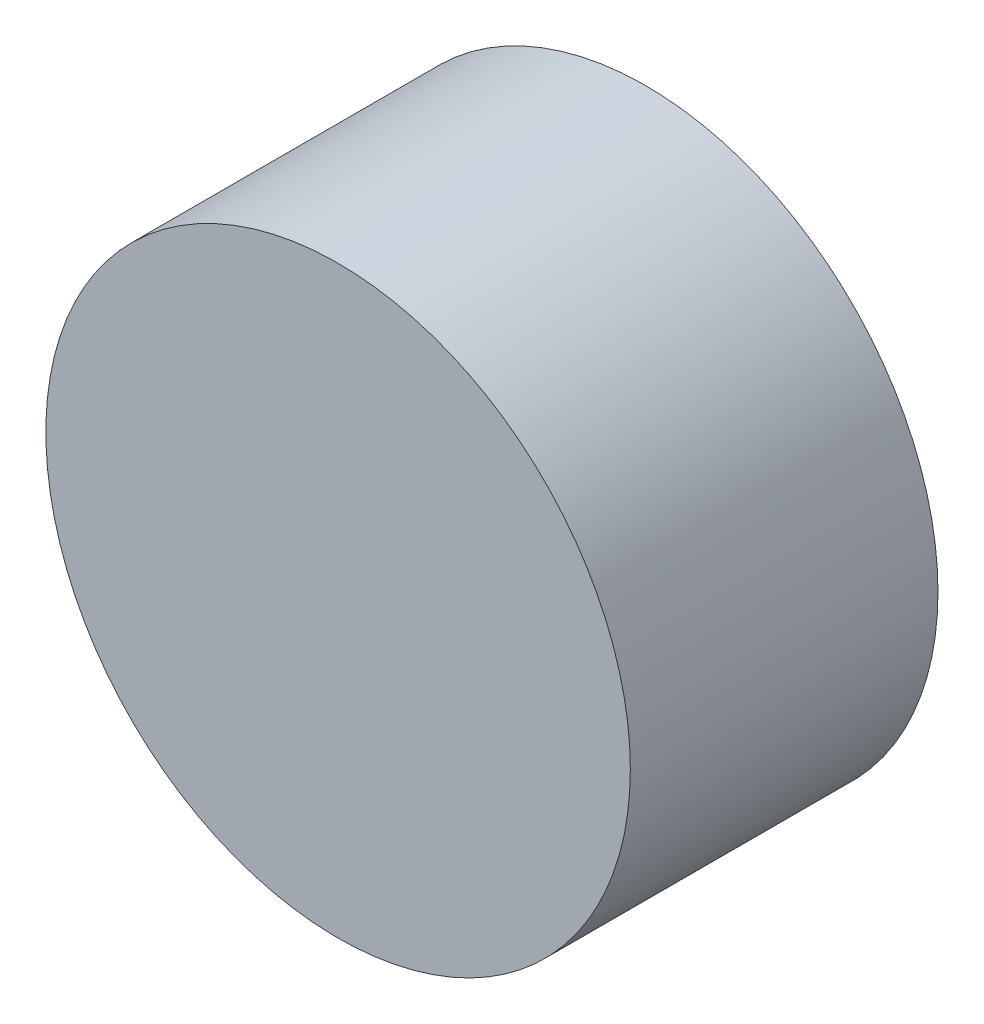
ISO-10303-21;
HEADER;
FILE_DESCRIPTION(('STEP AP214'),'2;1');
FILE_NAME('part.step','',(''),(''),'','','');
FILE_SCHEMA(('AUTOMOTIVE_DESIGN { 1 0 10303 214 1 1 1 1 }'));
ENDSEC;
DATA;
#1=APPLICATION_CONTEXT('core data for automotive mechanical design processes');
#2=APPLICATION_PROTOCOL_DEFINITION('international standard','automotive_design',2000,#1);
#3=PRODUCT_CONTEXT('',#1,'mechanical');
#4=PRODUCT('Part','Part','',(#3));
#5=PRODUCT_RELATED_PRODUCT_CATEGORY('part','',(#4));
#6=PRODUCT_DEFINITION_FORMATION('','',#4);
#7=PRODUCT_DEFINITION_CONTEXT('part definition',#1,'design');
#8=PRODUCT_DEFINITION('design','',#6,#7);
#9=PRODUCT_DEFINITION_SHAPE('','',#8);
#10=(LENGTH_UNIT() NAMED_UNIT(*) SI_UNIT(.MILLI.,.METRE.));
#11=(NAMED_UNIT(*) PLANE_ANGLE_UNIT() SI_UNIT($,.RADIAN.));
#12=(NAMED_UNIT(*) SI_UNIT($,.STERADIAN.) SOLID_ANGLE_UNIT());
#13=UNCERTAINTY_MEASURE_WITH_UNIT(LENGTH_MEASURE(1.E-05),#10,'distance_accuracy_value','');
#14=(GEOMETRIC_REPRESENTATION_CONTEXT(3) GLOBAL_UNCERTAINTY_ASSIGNED_CONTEXT((#13)) GLOBAL_UNIT_ASSIGNED_CONTEXT((#10,
#11,#12)) REPRESENTATION_CONTEXT('',''));
#15=CARTESIAN_POINT('',(0.,0.,0.));
#16=DIRECTION('',(0.,0.,1.));
#17=DIRECTION('',(1.,0.,0.));
#18=AXIS2_PLACEMENT_3D('',#15,#16,#17);
#19=CARTESIAN_POINT('',(0.,0.,60.));
#20=DIRECTION('',(0.,0.,-1.));
#21=DIRECTION('',(-1.,0.,0.));
#22=AXIS2_PLACEMENT_3D('',#19,#20,#21);
#23=CYLINDRICAL_SURFACE('',#22,57.);
#24=CARTESIAN_POINT('',(0.,0.,60.));
#25=DIRECTION('',(0.,0.,1.));
#26=DIRECTION('',(1.,0.,0.));
#27=AXIS2_PLACEMENT_3D('',#24,#25,#26);
#28=CIRCLE('',#27,57.);
#29=CARTESIAN_POINT('',(57.,0.,60.));
#30=VERTEX_POINT('',#29);
#31=EDGE_CURVE('E10',#30,#30,#28,.T.);
#32=ORIENTED_EDGE('',*,*,#31,.F.);
#33=EDGE_LOOP('',(#32));
#34=FACE_BOUND('',#33,.T.);
#35=CARTESIAN_POINT('',(0.,0.,0.));
#36=DIRECTION('',(0.,0.,1.));
#37=DIRECTION('',(1.,0.,0.));
#38=AXIS2_PLACEMENT_3D('',#35,#36,#37);
#39=CIRCLE('',#38,57.);
#40=CARTESIAN_POINT('',(57.,0.,0.));
#41=VERTEX_POINT('',#40);
#42=EDGE_CURVE('E46',#41,#41,#39,.T.);
#43=ORIENTED_EDGE('',*,*,#42,.T.);
#44=EDGE_LOOP('',(#43));
#45=FACE_BOUND('',#44,.T.);
#46=ADVANCED_FACE('F43',(#34,#45),#23,.T.);
#47=CARTESIAN_POINT('',(0.,0.,60.));
#48=DIRECTION('',(0.,0.,1.));
#49=DIRECTION('',(1.,0.,0.));
#50=AXIS2_PLACEMENT_3D('',#47,#48,#49);
#51=PLANE('',#50);
#52=ORIENTED_EDGE('',*,*,#31,.T.);
#53=EDGE_LOOP('',(#52));
#54=FACE_BOUND('',#53,.T.);
#55=ADVANCED_FACE('F60',(#54),#51,.T.);
#56=CARTESIAN_POINT('',(0.,0.,0.));
#57=DIRECTION('',(0.,0.,1.));
#58=DIRECTION('',(1.,0.,0.));
#59=AXIS2_PLACEMENT_3D('',#56,#57,#58);
#60=PLANE('',#59);
#61=ORIENTED_EDGE('',*,*,#42,.F.);
#62=EDGE_LOOP('',(#61));
#63=FACE_BOUND('',#62,.T.);
#64=ADVANCED_FACE('F58',(#63),#60,.F.);
#65=CLOSED_SHELL('',(#46,#55,#64));
#66=MANIFOLD_SOLID_BREP('B2',#65);
#67=ADVANCED_BREP_SHAPE_REPRESENTATION('',(#18,#66),#14);
#68=SHAPE_DEFINITION_REPRESENTATION(#9,#67);
ENDSEC;
END-ISO-10303-21;
